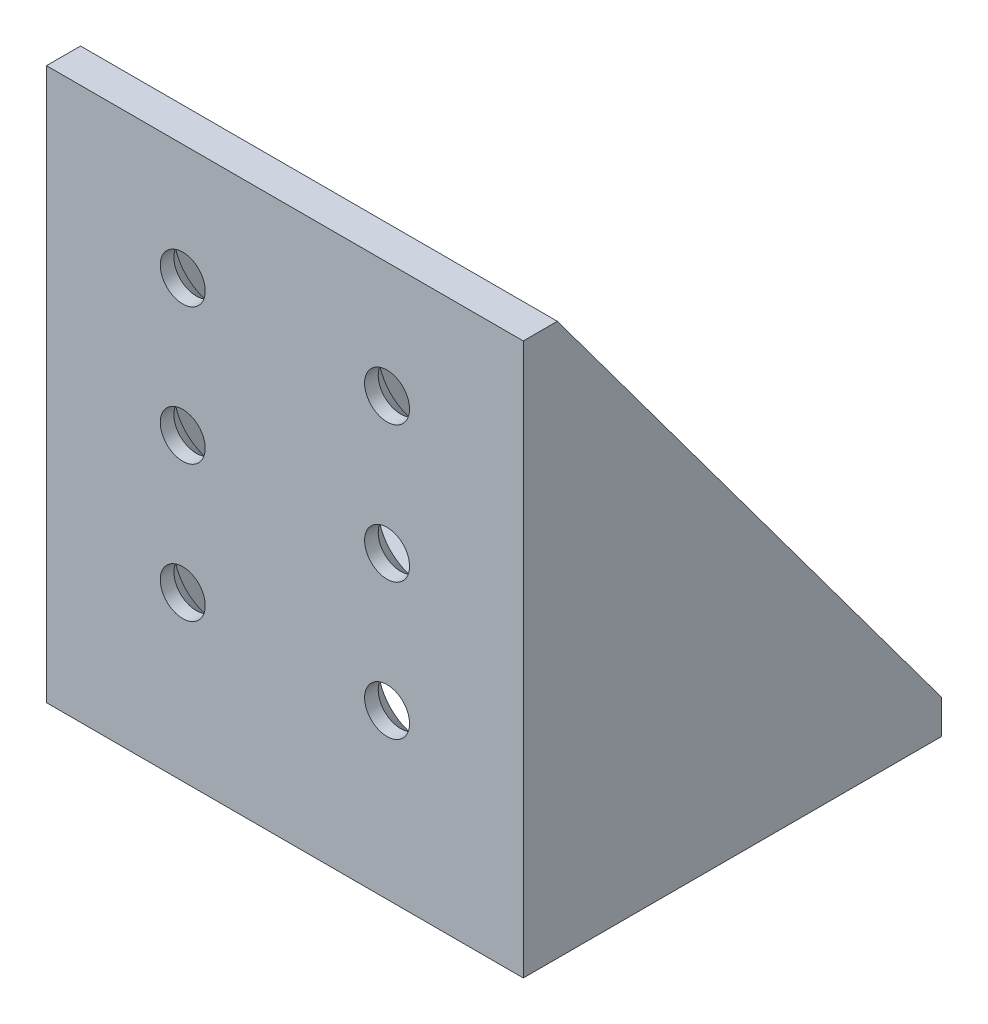
ISO-10303-21;
HEADER;
FILE_DESCRIPTION(('STEP AP214'),'2;1');
FILE_NAME('part.step','',(''),(''),'','','');
FILE_SCHEMA(('AUTOMOTIVE_DESIGN { 1 0 10303 214 1 1 1 1 }'));
ENDSEC;
DATA;
#1=APPLICATION_CONTEXT('core data for automotive mechanical design processes');
#2=APPLICATION_PROTOCOL_DEFINITION('international standard','automotive_design',2000,#1);
#3=PRODUCT_CONTEXT('',#1,'mechanical');
#4=PRODUCT('Part','Part','',(#3));
#5=PRODUCT_RELATED_PRODUCT_CATEGORY('part','',(#4));
#6=PRODUCT_DEFINITION_FORMATION('','',#4);
#7=PRODUCT_DEFINITION_CONTEXT('part definition',#1,'design');
#8=PRODUCT_DEFINITION('design','',#6,#7);
#9=PRODUCT_DEFINITION_SHAPE('','',#8);
#10=(LENGTH_UNIT() NAMED_UNIT(*) SI_UNIT(.MILLI.,.METRE.));
#11=(NAMED_UNIT(*) PLANE_ANGLE_UNIT() SI_UNIT($,.RADIAN.));
#12=(NAMED_UNIT(*) SI_UNIT($,.STERADIAN.) SOLID_ANGLE_UNIT());
#13=UNCERTAINTY_MEASURE_WITH_UNIT(LENGTH_MEASURE(1.E-05),#10,'distance_accuracy_value','');
#14=(GEOMETRIC_REPRESENTATION_CONTEXT(3) GLOBAL_UNCERTAINTY_ASSIGNED_CONTEXT((#13)) GLOBAL_UNIT_ASSIGNED_CONTEXT((#10,
#11,#12)) REPRESENTATION_CONTEXT('',''));
#15=CARTESIAN_POINT('',(0.,0.,0.));
#16=DIRECTION('',(0.,0.,1.));
#17=DIRECTION('',(1.,0.,0.));
#18=AXIS2_PLACEMENT_3D('',#15,#16,#17);
#19=CARTESIAN_POINT('',(70.,4.99999999999989,-61.4000000000002));
#20=DIRECTION('',(0.,-1.,0.));
#21=DIRECTION('',(0.,0.,-1.));
#22=AXIS2_PLACEMENT_3D('',#19,#20,#21);
#23=PLANE('',#22);
#24=CARTESIAN_POINT('',(35.,5.,-33.2000000000001));
#25=DIRECTION('',(0.,1.,0.));
#26=DIRECTION('',(0.,0.,1.));
#27=AXIS2_PLACEMENT_3D('',#24,#25,#26);
#28=CIRCLE('',#27,19.05);
#29=CARTESIAN_POINT('',(35.,5.,-14.1500000000001));
#30=VERTEX_POINT('',#29);
#31=EDGE_CURVE('E346',#30,#30,#28,.T.);
#32=ORIENTED_EDGE('',*,*,#31,.F.);
#33=EDGE_LOOP('',(#32));
#34=FACE_BOUND('',#33,.T.);
#35=CARTESIAN_POINT('',(11.455,4.99999999999989,-57.1375114030285));
#36=DIRECTION('',(0.,1.,0.));
#37=DIRECTION('',(0.,0.,1.));
#38=AXIS2_PLACEMENT_3D('',#35,#36,#37);
#39=CIRCLE('',#38,1.64999999999999);
#40=CARTESIAN_POINT('',(11.455,4.99999999999989,-55.4875114030285));
#41=VERTEX_POINT('',#40);
#42=EDGE_CURVE('E349',#41,#41,#39,.T.);
#43=ORIENTED_EDGE('',*,*,#42,.F.);
#44=EDGE_LOOP('',(#43));
#45=FACE_BOUND('',#44,.T.);
#46=CARTESIAN_POINT('',(58.5450000000001,4.99999999999989,-57.1375114030285));
#47=DIRECTION('',(0.,1.,0.));
#48=DIRECTION('',(0.,0.,1.));
#49=AXIS2_PLACEMENT_3D('',#46,#47,#48);
#50=CIRCLE('',#49,1.64999999999999);
#51=CARTESIAN_POINT('',(58.5450000000001,4.99999999999989,-55.4875114030285));
#52=VERTEX_POINT('',#51);
#53=EDGE_CURVE('E355',#52,#52,#50,.T.);
#54=ORIENTED_EDGE('',*,*,#53,.F.);
#55=EDGE_LOOP('',(#54));
#56=FACE_BOUND('',#55,.T.);
#57=CARTESIAN_POINT('',(11.455,5.,-10.0475114030284));
#58=DIRECTION('',(0.,1.,0.));
#59=DIRECTION('',(0.,0.,1.));
#60=AXIS2_PLACEMENT_3D('',#57,#58,#59);
#61=CIRCLE('',#60,1.64999999999999);
#62=CARTESIAN_POINT('',(11.455,5.,-8.39751140302841));
#63=VERTEX_POINT('',#62);
#64=EDGE_CURVE('E361',#63,#63,#61,.T.);
#65=ORIENTED_EDGE('',*,*,#64,.F.);
#66=EDGE_LOOP('',(#65));
#67=FACE_BOUND('',#66,.T.);
#68=CARTESIAN_POINT('',(58.5450000000001,5.,-10.0475114030285));
#69=DIRECTION('',(0.,1.,0.));
#70=DIRECTION('',(0.,0.,1.));
#71=AXIS2_PLACEMENT_3D('',#68,#69,#70);
#72=CIRCLE('',#71,1.64999999999999);
#73=CARTESIAN_POINT('',(58.5450000000001,5.,-8.39751140302854));
#74=VERTEX_POINT('',#73);
#75=EDGE_CURVE('E367',#74,#74,#72,.T.);
#76=ORIENTED_EDGE('',*,*,#75,.F.);
#77=EDGE_LOOP('',(#76));
#78=FACE_BOUND('',#77,.T.);
#79=DIRECTION('',(0.,0.,-1.));
#80=VECTOR('',#79,1.);
#81=CARTESIAN_POINT('',(6.80000000000003,4.99999999999989,-61.4));
#82=LINE('',#81,#80);
#83=CARTESIAN_POINT('',(6.79999999999999,5.,-5.00000000000012));
#84=VERTEX_POINT('',#83);
#85=CARTESIAN_POINT('',(6.80000000000003,4.99999999999989,-61.4));
#86=VERTEX_POINT('',#85);
#87=EDGE_CURVE('E50',#84,#86,#82,.T.);
#88=ORIENTED_EDGE('',*,*,#87,.F.);
#89=DIRECTION('',(-1.,0.,0.));
#90=VECTOR('',#89,1.);
#91=CARTESIAN_POINT('',(70.,5.,-5.00000000000012));
#92=LINE('',#91,#90);
#93=CARTESIAN_POINT('',(63.2,5.,-5.));
#94=VERTEX_POINT('',#93);
#95=EDGE_CURVE('E112',#94,#84,#92,.T.);
#96=ORIENTED_EDGE('',*,*,#95,.F.);
#97=DIRECTION('',(0.,0.,-1.));
#98=VECTOR('',#97,1.);
#99=CARTESIAN_POINT('',(63.2000000000001,4.99999999999989,-61.4000000000002));
#100=LINE('',#99,#98);
#101=CARTESIAN_POINT('',(63.2000000000001,4.99999999999989,-61.4000000000002));
#102=VERTEX_POINT('',#101);
#103=EDGE_CURVE('E102',#94,#102,#100,.T.);
#104=ORIENTED_EDGE('',*,*,#103,.T.);
#105=DIRECTION('',(-1.,0.,0.));
#106=VECTOR('',#105,1.);
#107=CARTESIAN_POINT('',(70.,4.99999999999989,-61.4000000000002));
#108=LINE('',#107,#106);
#109=EDGE_CURVE('E119',#102,#86,#108,.T.);
#110=ORIENTED_EDGE('',*,*,#109,.T.);
#111=EDGE_LOOP('',(#88,#96,#104,#110));
#112=FACE_BOUND('',#111,.T.);
#113=ADVANCED_FACE('F34',(#34,#45,#56,#67,#78,#112),#23,.F.);
#114=CARTESIAN_POINT('',(70.,5.,-5.00000000000012));
#115=DIRECTION('',(0.,0.,1.));
#116=DIRECTION('',(0.,-1.,0.));
#117=AXIS2_PLACEMENT_3D('',#114,#115,#116);
#118=PLANE('',#117);
#119=CARTESIAN_POINT('',(50.,64.,-5.00000000000012));
#120=DIRECTION('',(0.,0.,-1.));
#121=DIRECTION('',(0.,1.,0.));
#122=AXIS2_PLACEMENT_3D('',#119,#120,#121);
#123=CIRCLE('',#122,6.3);
#124=CARTESIAN_POINT('',(50.,70.3,-5.00000000000012));
#125=VERTEX_POINT('',#124);
#126=EDGE_CURVE('E295',#125,#125,#123,.T.);
#127=ORIENTED_EDGE('',*,*,#126,.F.);
#128=EDGE_LOOP('',(#127));
#129=FACE_BOUND('',#128,.T.);
#130=CARTESIAN_POINT('',(20.,64.,-5.00000000000012));
#131=DIRECTION('',(0.,0.,-1.));
#132=DIRECTION('',(0.,1.,0.));
#133=AXIS2_PLACEMENT_3D('',#130,#131,#132);
#134=CIRCLE('',#133,6.3);
#135=CARTESIAN_POINT('',(20.,70.3,-5.00000000000012));
#136=VERTEX_POINT('',#135);
#137=EDGE_CURVE('E301',#136,#136,#134,.T.);
#138=ORIENTED_EDGE('',*,*,#137,.F.);
#139=EDGE_LOOP('',(#138));
#140=FACE_BOUND('',#139,.T.);
#141=CARTESIAN_POINT('',(50.,44.,-5.00000000000012));
#142=DIRECTION('',(0.,0.,-1.));
#143=DIRECTION('',(0.,1.,0.));
#144=AXIS2_PLACEMENT_3D('',#141,#142,#143);
#145=CIRCLE('',#144,6.3);
#146=CARTESIAN_POINT('',(50.,50.3,-5.00000000000012));
#147=VERTEX_POINT('',#146);
#148=EDGE_CURVE('E310',#147,#147,#145,.T.);
#149=ORIENTED_EDGE('',*,*,#148,.F.);
#150=EDGE_LOOP('',(#149));
#151=FACE_BOUND('',#150,.T.);
#152=CARTESIAN_POINT('',(20.,44.,-5.00000000000012));
#153=DIRECTION('',(0.,0.,-1.));
#154=DIRECTION('',(0.,1.,0.));
#155=AXIS2_PLACEMENT_3D('',#152,#153,#154);
#156=CIRCLE('',#155,6.3);
#157=CARTESIAN_POINT('',(20.,50.3,-5.00000000000012));
#158=VERTEX_POINT('',#157);
#159=EDGE_CURVE('E319',#158,#158,#156,.T.);
#160=ORIENTED_EDGE('',*,*,#159,.F.);
#161=EDGE_LOOP('',(#160));
#162=FACE_BOUND('',#161,.T.);
#163=CARTESIAN_POINT('',(50.,24.,-5.00000000000012));
#164=DIRECTION('',(0.,0.,-1.));
#165=DIRECTION('',(0.,1.,0.));
#166=AXIS2_PLACEMENT_3D('',#163,#164,#165);
#167=CIRCLE('',#166,6.3);
#168=CARTESIAN_POINT('',(50.,30.3,-5.00000000000012));
#169=VERTEX_POINT('',#168);
#170=EDGE_CURVE('E328',#169,#169,#167,.T.);
#171=ORIENTED_EDGE('',*,*,#170,.F.);
#172=EDGE_LOOP('',(#171));
#173=FACE_BOUND('',#172,.T.);
#174=CARTESIAN_POINT('',(20.,24.,-5.00000000000012));
#175=DIRECTION('',(0.,0.,-1.));
#176=DIRECTION('',(0.,1.,0.));
#177=AXIS2_PLACEMENT_3D('',#174,#175,#176);
#178=CIRCLE('',#177,6.3);
#179=CARTESIAN_POINT('',(20.,30.3,-5.00000000000012));
#180=VERTEX_POINT('',#179);
#181=EDGE_CURVE('E337',#180,#180,#178,.T.);
#182=ORIENTED_EDGE('',*,*,#181,.F.);
#183=EDGE_LOOP('',(#182));
#184=FACE_BOUND('',#183,.T.);
#185=DIRECTION('',(0.,-1.,0.));
#186=VECTOR('',#185,1.);
#187=CARTESIAN_POINT('',(6.79999999999999,5.,-5.00000000000012));
#188=LINE('',#187,#186);
#189=CARTESIAN_POINT('',(6.79999999999999,81.,-5.00000000000012));
#190=VERTEX_POINT('',#189);
#191=EDGE_CURVE('E373',#190,#84,#188,.T.);
#192=ORIENTED_EDGE('',*,*,#191,.F.);
#193=DIRECTION('',(-1.,0.,0.));
#194=VECTOR('',#193,1.);
#195=CARTESIAN_POINT('',(70.,81.,-5.00000000000012));
#196=LINE('',#195,#194);
#197=CARTESIAN_POINT('',(63.2,81.,-5.00000000000003));
#198=VERTEX_POINT('',#197);
#199=EDGE_CURVE('E115',#198,#190,#196,.T.);
#200=ORIENTED_EDGE('',*,*,#199,.F.);
#201=DIRECTION('',(0.,-1.,0.));
#202=VECTOR('',#201,1.);
#203=CARTESIAN_POINT('',(63.2,5.,-5.));
#204=LINE('',#203,#202);
#205=EDGE_CURVE('E105',#198,#94,#204,.T.);
#206=ORIENTED_EDGE('',*,*,#205,.T.);
#207=ORIENTED_EDGE('',*,*,#95,.T.);
#208=EDGE_LOOP('',(#192,#200,#206,#207));
#209=FACE_BOUND('',#208,.T.);
#210=ADVANCED_FACE('F111',(#129,#140,#151,#162,#173,#184,#209),#118,.F.);
#211=CARTESIAN_POINT('',(70.,81.,0.));
#212=DIRECTION('',(0.,0.,-1.));
#213=DIRECTION('',(0.,1.,0.));
#214=AXIS2_PLACEMENT_3D('',#211,#212,#213);
#215=PLANE('',#214);
#216=CARTESIAN_POINT('',(50.,64.,-1.11022302462516E-13));
#217=DIRECTION('',(0.,0.,-1.));
#218=DIRECTION('',(0.,1.,0.));
#219=AXIS2_PLACEMENT_3D('',#216,#217,#218);
#220=CIRCLE('',#219,3.3);
#221=CARTESIAN_POINT('',(50.,67.3,-1.11097625981867E-13));
#222=VERTEX_POINT('',#221);
#223=EDGE_CURVE('E297',#222,#222,#220,.T.);
#224=ORIENTED_EDGE('',*,*,#223,.T.);
#225=EDGE_LOOP('',(#224));
#226=FACE_BOUND('',#225,.T.);
#227=CARTESIAN_POINT('',(20.,64.,0.));
#228=DIRECTION('',(0.,0.,-1.));
#229=DIRECTION('',(0.,1.,0.));
#230=AXIS2_PLACEMENT_3D('',#227,#228,#229);
#231=CIRCLE('',#230,3.3);
#232=CARTESIAN_POINT('',(20.,67.3,0.));
#233=VERTEX_POINT('',#232);
#234=EDGE_CURVE('E307',#233,#233,#231,.T.);
#235=ORIENTED_EDGE('',*,*,#234,.T.);
#236=EDGE_LOOP('',(#235));
#237=FACE_BOUND('',#236,.T.);
#238=CARTESIAN_POINT('',(50.,44.,0.));
#239=DIRECTION('',(0.,0.,-1.));
#240=DIRECTION('',(0.,1.,0.));
#241=AXIS2_PLACEMENT_3D('',#238,#239,#240);
#242=CIRCLE('',#241,3.3);
#243=CARTESIAN_POINT('',(50.,47.3,0.));
#244=VERTEX_POINT('',#243);
#245=EDGE_CURVE('E316',#244,#244,#242,.T.);
#246=ORIENTED_EDGE('',*,*,#245,.T.);
#247=EDGE_LOOP('',(#246));
#248=FACE_BOUND('',#247,.T.);
#249=CARTESIAN_POINT('',(20.,44.,0.));
#250=DIRECTION('',(0.,0.,-1.));
#251=DIRECTION('',(0.,1.,0.));
#252=AXIS2_PLACEMENT_3D('',#249,#250,#251);
#253=CIRCLE('',#252,3.3);
#254=CARTESIAN_POINT('',(20.,47.3,0.));
#255=VERTEX_POINT('',#254);
#256=EDGE_CURVE('E325',#255,#255,#253,.T.);
#257=ORIENTED_EDGE('',*,*,#256,.T.);
#258=EDGE_LOOP('',(#257));
#259=FACE_BOUND('',#258,.T.);
#260=CARTESIAN_POINT('',(50.,24.,0.));
#261=DIRECTION('',(0.,0.,-1.));
#262=DIRECTION('',(0.,1.,0.));
#263=AXIS2_PLACEMENT_3D('',#260,#261,#262);
#264=CIRCLE('',#263,3.3);
#265=CARTESIAN_POINT('',(50.,27.3,0.));
#266=VERTEX_POINT('',#265);
#267=EDGE_CURVE('E334',#266,#266,#264,.T.);
#268=ORIENTED_EDGE('',*,*,#267,.T.);
#269=EDGE_LOOP('',(#268));
#270=FACE_BOUND('',#269,.T.);
#271=CARTESIAN_POINT('',(20.,24.,0.));
#272=DIRECTION('',(0.,0.,-1.));
#273=DIRECTION('',(0.,1.,0.));
#274=AXIS2_PLACEMENT_3D('',#271,#272,#273);
#275=CIRCLE('',#274,3.3);
#276=CARTESIAN_POINT('',(20.,27.3,0.));
#277=VERTEX_POINT('',#276);
#278=EDGE_CURVE('E343',#277,#277,#275,.T.);
#279=ORIENTED_EDGE('',*,*,#278,.T.);
#280=EDGE_LOOP('',(#279));
#281=FACE_BOUND('',#280,.T.);
#282=DIRECTION('',(0.,-1.,0.));
#283=VECTOR('',#282,1.);
#284=CARTESIAN_POINT('',(0.,81.,-1.11022302462516E-13));
#285=LINE('',#284,#283);
#286=CARTESIAN_POINT('',(0.,81.,-1.11022302462516E-13));
#287=VERTEX_POINT('',#286);
#288=CARTESIAN_POINT('',(0.,0.,0.));
#289=VERTEX_POINT('',#288);
#290=EDGE_CURVE('E149',#287,#289,#285,.T.);
#291=ORIENTED_EDGE('',*,*,#290,.T.);
#292=DIRECTION('',(-1.,0.,0.));
#293=VECTOR('',#292,1.);
#294=CARTESIAN_POINT('',(70.,0.,-1.11022302462516E-13));
#295=LINE('',#294,#293);
#296=CARTESIAN_POINT('',(70.,0.,-1.11022302462516E-13));
#297=VERTEX_POINT('',#296);
#298=EDGE_CURVE('E11',#297,#289,#295,.T.);
#299=ORIENTED_EDGE('',*,*,#298,.F.);
#300=DIRECTION('',(0.,-1.,0.));
#301=VECTOR('',#300,1.);
#302=CARTESIAN_POINT('',(70.,81.,0.));
#303=LINE('',#302,#301);
#304=CARTESIAN_POINT('',(70.,81.,0.));
#305=VERTEX_POINT('',#304);
#306=EDGE_CURVE('E147',#305,#297,#303,.T.);
#307=ORIENTED_EDGE('',*,*,#306,.F.);
#308=DIRECTION('',(-1.,0.,0.));
#309=VECTOR('',#308,1.);
#310=CARTESIAN_POINT('',(70.,81.,0.));
#311=LINE('',#310,#309);
#312=EDGE_CURVE('E152',#305,#287,#311,.T.);
#313=ORIENTED_EDGE('',*,*,#312,.T.);
#314=EDGE_LOOP('',(#291,#299,#307,#313));
#315=FACE_BOUND('',#314,.T.);
#316=ADVANCED_FACE('F36',(#226,#237,#248,#259,#270,#281,#315),#215,.F.);
#317=CARTESIAN_POINT('',(70.,0.,-1.11022302462516E-13));
#318=DIRECTION('',(0.,1.,0.));
#319=DIRECTION('',(0.,0.,1.));
#320=AXIS2_PLACEMENT_3D('',#317,#318,#319);
#321=PLANE('',#320);
#322=CARTESIAN_POINT('',(35.,0.,-33.2000000000001));
#323=DIRECTION('',(0.,1.,0.));
#324=DIRECTION('',(0.,0.,1.));
#325=AXIS2_PLACEMENT_3D('',#322,#323,#324);
#326=CIRCLE('',#325,19.05);
#327=CARTESIAN_POINT('',(35.,0.,-14.1500000000001));
#328=VERTEX_POINT('',#327);
#329=EDGE_CURVE('E38',#328,#328,#326,.T.);
#330=ORIENTED_EDGE('',*,*,#329,.T.);
#331=EDGE_LOOP('',(#330));
#332=FACE_BOUND('',#331,.T.);
#333=CARTESIAN_POINT('',(11.455,-1.11022302462516E-13,-57.1375114030285));
#334=DIRECTION('',(0.,1.,0.));
#335=DIRECTION('',(0.,0.,1.));
#336=AXIS2_PLACEMENT_3D('',#333,#334,#335);
#337=CIRCLE('',#336,1.65);
#338=CARTESIAN_POINT('',(11.455,-1.11225302018215E-13,-55.4875114030285));
#339=VERTEX_POINT('',#338);
#340=EDGE_CURVE('E352',#339,#339,#337,.T.);
#341=ORIENTED_EDGE('',*,*,#340,.T.);
#342=EDGE_LOOP('',(#341));
#343=FACE_BOUND('',#342,.T.);
#344=CARTESIAN_POINT('',(58.5450000000001,-1.11022302462516E-13,-57.1375114030285));
#345=DIRECTION('',(0.,1.,0.));
#346=DIRECTION('',(0.,0.,1.));
#347=AXIS2_PLACEMENT_3D('',#344,#345,#346);
#348=CIRCLE('',#347,1.65);
#349=CARTESIAN_POINT('',(58.5450000000001,-1.11225302018215E-13,-55.4875114030285));
#350=VERTEX_POINT('',#349);
#351=EDGE_CURVE('E358',#350,#350,#348,.T.);
#352=ORIENTED_EDGE('',*,*,#351,.T.);
#353=EDGE_LOOP('',(#352));
#354=FACE_BOUND('',#353,.T.);
#355=CARTESIAN_POINT('',(11.455,0.,-10.0475114030284));
#356=DIRECTION('',(0.,1.,0.));
#357=DIRECTION('',(0.,0.,1.));
#358=AXIS2_PLACEMENT_3D('',#355,#356,#357);
#359=CIRCLE('',#358,1.65);
#360=CARTESIAN_POINT('',(11.455,0.,-8.3975114030284));
#361=VERTEX_POINT('',#360);
#362=EDGE_CURVE('E364',#361,#361,#359,.T.);
#363=ORIENTED_EDGE('',*,*,#362,.T.);
#364=EDGE_LOOP('',(#363));
#365=FACE_BOUND('',#364,.T.);
#366=CARTESIAN_POINT('',(58.5450000000001,0.,-10.0475114030285));
#367=DIRECTION('',(0.,1.,0.));
#368=DIRECTION('',(0.,0.,1.));
#369=AXIS2_PLACEMENT_3D('',#366,#367,#368);
#370=CIRCLE('',#369,1.65);
#371=CARTESIAN_POINT('',(58.5450000000001,0.,-8.39751140302854));
#372=VERTEX_POINT('',#371);
#373=EDGE_CURVE('E370',#372,#372,#370,.T.);
#374=ORIENTED_EDGE('',*,*,#373,.T.);
#375=EDGE_LOOP('',(#374));
#376=FACE_BOUND('',#375,.T.);
#377=DIRECTION('',(0.,0.,-1.));
#378=VECTOR('',#377,1.);
#379=CARTESIAN_POINT('',(0.,0.,0.));
#380=LINE('',#379,#378);
#381=CARTESIAN_POINT('',(0.,-1.11022302462516E-13,-61.4000000000001));
#382=VERTEX_POINT('',#381);
#383=EDGE_CURVE('E142',#289,#382,#380,.T.);
#384=ORIENTED_EDGE('',*,*,#383,.T.);
#385=DIRECTION('',(-1.,0.,0.));
#386=VECTOR('',#385,1.);
#387=CARTESIAN_POINT('',(70.,-1.11022302462516E-13,-61.4000000000002));
#388=LINE('',#387,#386);
#389=CARTESIAN_POINT('',(70.,-1.11022302462516E-13,-61.4000000000002));
#390=VERTEX_POINT('',#389);
#391=EDGE_CURVE('E43',#390,#382,#388,.T.);
#392=ORIENTED_EDGE('',*,*,#391,.F.);
#393=DIRECTION('',(0.,0.,-1.));
#394=VECTOR('',#393,1.);
#395=CARTESIAN_POINT('',(70.,0.,-1.11022302462516E-13));
#396=LINE('',#395,#394);
#397=EDGE_CURVE('E164',#297,#390,#396,.T.);
#398=ORIENTED_EDGE('',*,*,#397,.F.);
#399=ORIENTED_EDGE('',*,*,#298,.T.);
#400=EDGE_LOOP('',(#384,#392,#398,#399));
#401=FACE_BOUND('',#400,.T.);
#402=ADVANCED_FACE('F173',(#332,#343,#354,#365,#376,#401),#321,.F.);
#403=CARTESIAN_POINT('',(70.,-1.11022302462516E-13,-61.4000000000002));
#404=DIRECTION('',(0.,0.,1.));
#405=DIRECTION('',(1.,0.,0.));
#406=AXIS2_PLACEMENT_3D('',#403,#404,#405);
#407=PLANE('',#406);
#408=DIRECTION('',(0.,1.,0.));
#409=VECTOR('',#408,1.);
#410=CARTESIAN_POINT('',(0.,-1.11022302462516E-13,-61.4000000000001));
#411=LINE('',#410,#409);
#412=CARTESIAN_POINT('',(0.,4.99999999999989,-61.4000000000001));
#413=VERTEX_POINT('',#412);
#414=EDGE_CURVE('E132',#382,#413,#411,.T.);
#415=ORIENTED_EDGE('',*,*,#414,.T.);
#416=DIRECTION('',(-1.,0.,0.));
#417=VECTOR('',#416,1.);
#418=CARTESIAN_POINT('',(6.80000000000003,4.99999999999989,-61.4));
#419=LINE('',#418,#417);
#420=EDGE_CURVE('E58',#86,#413,#419,.T.);
#421=ORIENTED_EDGE('',*,*,#420,.F.);
#422=ORIENTED_EDGE('',*,*,#109,.F.);
#423=CARTESIAN_POINT('',(70.,4.99999999999989,-61.4000000000002));
#424=VERTEX_POINT('',#423);
#425=EDGE_CURVE('E122',#424,#102,#108,.T.);
#426=ORIENTED_EDGE('',*,*,#425,.F.);
#427=DIRECTION('',(0.,1.,0.));
#428=VECTOR('',#427,1.);
#429=CARTESIAN_POINT('',(70.,-1.11022302462516E-13,-61.4000000000002));
#430=LINE('',#429,#428);
#431=EDGE_CURVE('E135',#390,#424,#430,.T.);
#432=ORIENTED_EDGE('',*,*,#431,.F.);
#433=ORIENTED_EDGE('',*,*,#391,.T.);
#434=EDGE_LOOP('',(#415,#421,#422,#426,#432,#433));
#435=FACE_BOUND('',#434,.T.);
#436=ADVANCED_FACE('F131',(#435),#407,.F.);
#437=CARTESIAN_POINT('',(70.,81.,-5.00000000000012));
#438=DIRECTION('',(0.,-1.,0.));
#439=DIRECTION('',(0.,0.,-1.));
#440=AXIS2_PLACEMENT_3D('',#437,#438,#439);
#441=PLANE('',#440);
#442=DIRECTION('',(0.,0.,1.));
#443=VECTOR('',#442,1.);
#444=CARTESIAN_POINT('',(0.,81.,-5.00000000000012));
#445=LINE('',#444,#443);
#446=CARTESIAN_POINT('',(0.,81.,-5.00000000000012));
#447=VERTEX_POINT('',#446);
#448=EDGE_CURVE('E145',#447,#287,#445,.T.);
#449=ORIENTED_EDGE('',*,*,#448,.T.);
#450=ORIENTED_EDGE('',*,*,#312,.F.);
#451=DIRECTION('',(0.,0.,1.));
#452=VECTOR('',#451,1.);
#453=CARTESIAN_POINT('',(70.,81.,-5.00000000000012));
#454=LINE('',#453,#452);
#455=CARTESIAN_POINT('',(70.,81.,-5.00000000000012));
#456=VERTEX_POINT('',#455);
#457=EDGE_CURVE('E154',#456,#305,#454,.T.);
#458=ORIENTED_EDGE('',*,*,#457,.F.);
#459=EDGE_CURVE('E120',#456,#198,#196,.T.);
#460=ORIENTED_EDGE('',*,*,#459,.T.);
#461=ORIENTED_EDGE('',*,*,#199,.T.);
#462=DIRECTION('',(-1.,0.,0.));
#463=VECTOR('',#462,1.);
#464=CARTESIAN_POINT('',(6.79999999999999,81.,-5.00000000000012));
#465=LINE('',#464,#463);
#466=EDGE_CURVE('E379',#190,#447,#465,.T.);
#467=ORIENTED_EDGE('',*,*,#466,.T.);
#468=EDGE_LOOP('',(#449,#450,#458,#460,#461,#467));
#469=FACE_BOUND('',#468,.T.);
#470=ADVANCED_FACE('F195',(#469),#441,.F.);
#471=CARTESIAN_POINT('',(70.,0.,-1.11022302462516E-13));
#472=DIRECTION('',(1.,0.,0.));
#473=DIRECTION('',(0.,0.,-1.));
#474=AXIS2_PLACEMENT_3D('',#471,#472,#473);
#475=PLANE('',#474);
#476=DIRECTION('',(0.,0.803032782324744,0.595934854251521));
#477=VECTOR('',#476,1.);
#478=CARTESIAN_POINT('',(70.,81.,-5.00000000000012));
#479=LINE('',#478,#477);
#480=EDGE_CURVE('E117',#424,#456,#479,.T.);
#481=ORIENTED_EDGE('',*,*,#480,.T.);
#482=ORIENTED_EDGE('',*,*,#457,.T.);
#483=ORIENTED_EDGE('',*,*,#306,.T.);
#484=ORIENTED_EDGE('',*,*,#397,.T.);
#485=ORIENTED_EDGE('',*,*,#431,.T.);
#486=EDGE_LOOP('',(#481,#482,#483,#484,#485));
#487=FACE_BOUND('',#486,.T.);
#488=ADVANCED_FACE('F172',(#487),#475,.T.);
#489=CARTESIAN_POINT('',(0.,0.,0.));
#490=DIRECTION('',(1.,0.,0.));
#491=DIRECTION('',(0.,0.,-1.));
#492=AXIS2_PLACEMENT_3D('',#489,#490,#491);
#493=PLANE('',#492);
#494=ORIENTED_EDGE('',*,*,#448,.F.);
#495=DIRECTION('',(0.,0.803032782324744,0.595934854251521));
#496=VECTOR('',#495,1.);
#497=CARTESIAN_POINT('',(0.,81.,-5.00000000000012));
#498=LINE('',#497,#496);
#499=EDGE_CURVE('E144',#413,#447,#498,.T.);
#500=ORIENTED_EDGE('',*,*,#499,.F.);
#501=ORIENTED_EDGE('',*,*,#414,.F.);
#502=ORIENTED_EDGE('',*,*,#383,.F.);
#503=ORIENTED_EDGE('',*,*,#290,.F.);
#504=EDGE_LOOP('',(#494,#500,#501,#502,#503));
#505=FACE_BOUND('',#504,.T.);
#506=ADVANCED_FACE('F140',(#505),#493,.F.);
#507=CARTESIAN_POINT('',(63.2,81.,-5.00000000000003));
#508=DIRECTION('',(0.,0.59593485425152,-0.803032782324745));
#509=DIRECTION('',(0.,0.803032782324744,0.595934854251521));
#510=AXIS2_PLACEMENT_3D('',#507,#508,#509);
#511=PLANE('',#510);
#512=ORIENTED_EDGE('',*,*,#480,.F.);
#513=ORIENTED_EDGE('',*,*,#425,.T.);
#514=DIRECTION('',(0.,0.803032782324744,0.595934854251521));
#515=VECTOR('',#514,1.);
#516=CARTESIAN_POINT('',(63.2,81.,-5.00000000000003));
#517=LINE('',#516,#515);
#518=EDGE_CURVE('E107',#102,#198,#517,.T.);
#519=ORIENTED_EDGE('',*,*,#518,.T.);
#520=ORIENTED_EDGE('',*,*,#459,.F.);
#521=EDGE_LOOP('',(#512,#513,#519,#520));
#522=FACE_BOUND('',#521,.T.);
#523=ADVANCED_FACE('F206',(#522),#511,.T.);
#524=CARTESIAN_POINT('',(63.2,0.,-1.11022302462516E-13));
#525=DIRECTION('',(1.,0.,0.));
#526=DIRECTION('',(0.,0.,-1.));
#527=AXIS2_PLACEMENT_3D('',#524,#525,#526);
#528=PLANE('',#527);
#529=ORIENTED_EDGE('',*,*,#205,.F.);
#530=ORIENTED_EDGE('',*,*,#518,.F.);
#531=ORIENTED_EDGE('',*,*,#103,.F.);
#532=EDGE_LOOP('',(#529,#530,#531));
#533=FACE_BOUND('',#532,.T.);
#534=ADVANCED_FACE('F104',(#533),#528,.F.);
#535=CARTESIAN_POINT('',(6.79999999999999,81.,-5.00000000000012));
#536=DIRECTION('',(0.,-0.59593485425152,0.803032782324745));
#537=DIRECTION('',(0.,-0.803032782324744,-0.595934854251521));
#538=AXIS2_PLACEMENT_3D('',#535,#536,#537);
#539=PLANE('',#538);
#540=ORIENTED_EDGE('',*,*,#499,.T.);
#541=ORIENTED_EDGE('',*,*,#466,.F.);
#542=DIRECTION('',(0.,0.803032782324744,0.595934854251521));
#543=VECTOR('',#542,1.);
#544=CARTESIAN_POINT('',(6.79999999999999,81.,-5.00000000000012));
#545=LINE('',#544,#543);
#546=EDGE_CURVE('E375',#86,#190,#545,.T.);
#547=ORIENTED_EDGE('',*,*,#546,.F.);
#548=ORIENTED_EDGE('',*,*,#420,.T.);
#549=EDGE_LOOP('',(#540,#541,#547,#548));
#550=FACE_BOUND('',#549,.T.);
#551=ADVANCED_FACE('F212',(#550),#539,.F.);
#552=CARTESIAN_POINT('',(6.79999999999999,0.,-1.11022302462516E-13));
#553=DIRECTION('',(-1.,0.,0.));
#554=DIRECTION('',(0.,0.,-1.));
#555=AXIS2_PLACEMENT_3D('',#552,#553,#554);
#556=PLANE('',#555);
#557=ORIENTED_EDGE('',*,*,#191,.T.);
#558=ORIENTED_EDGE('',*,*,#87,.T.);
#559=ORIENTED_EDGE('',*,*,#546,.T.);
#560=EDGE_LOOP('',(#557,#558,#559));
#561=FACE_BOUND('',#560,.T.);
#562=ADVANCED_FACE('F215',(#561),#556,.F.);
#563=CARTESIAN_POINT('',(58.5450000000001,5.,-10.0475114030285));
#564=DIRECTION('',(0.,1.,0.));
#565=DIRECTION('',(0.,0.,1.));
#566=AXIS2_PLACEMENT_3D('',#563,#564,#565);
#567=CYLINDRICAL_SURFACE('',#566,1.65);
#568=ORIENTED_EDGE('',*,*,#373,.F.);
#569=EDGE_LOOP('',(#568));
#570=FACE_BOUND('',#569,.T.);
#571=ORIENTED_EDGE('',*,*,#75,.T.);
#572=EDGE_LOOP('',(#571));
#573=FACE_BOUND('',#572,.T.);
#574=ADVANCED_FACE('F219',(#570,#573),#567,.F.);
#575=CARTESIAN_POINT('',(11.455,5.,-10.0475114030284));
#576=DIRECTION('',(0.,1.,0.));
#577=DIRECTION('',(0.,0.,1.));
#578=AXIS2_PLACEMENT_3D('',#575,#576,#577);
#579=CYLINDRICAL_SURFACE('',#578,1.64999999999999);
#580=ORIENTED_EDGE('',*,*,#362,.F.);
#581=EDGE_LOOP('',(#580));
#582=FACE_BOUND('',#581,.T.);
#583=ORIENTED_EDGE('',*,*,#64,.T.);
#584=EDGE_LOOP('',(#583));
#585=FACE_BOUND('',#584,.T.);
#586=ADVANCED_FACE('F223',(#582,#585),#579,.F.);
#587=CARTESIAN_POINT('',(58.5450000000001,4.99999999999989,-57.1375114030285));
#588=DIRECTION('',(0.,1.,0.));
#589=DIRECTION('',(0.,0.,1.));
#590=AXIS2_PLACEMENT_3D('',#587,#588,#589);
#591=CYLINDRICAL_SURFACE('',#590,1.65);
#592=ORIENTED_EDGE('',*,*,#351,.F.);
#593=EDGE_LOOP('',(#592));
#594=FACE_BOUND('',#593,.T.);
#595=ORIENTED_EDGE('',*,*,#53,.T.);
#596=EDGE_LOOP('',(#595));
#597=FACE_BOUND('',#596,.T.);
#598=ADVANCED_FACE('F227',(#594,#597),#591,.F.);
#599=CARTESIAN_POINT('',(11.455,4.99999999999989,-57.1375114030285));
#600=DIRECTION('',(0.,1.,0.));
#601=DIRECTION('',(0.,0.,1.));
#602=AXIS2_PLACEMENT_3D('',#599,#600,#601);
#603=CYLINDRICAL_SURFACE('',#602,1.64999999999999);
#604=ORIENTED_EDGE('',*,*,#340,.F.);
#605=EDGE_LOOP('',(#604));
#606=FACE_BOUND('',#605,.T.);
#607=ORIENTED_EDGE('',*,*,#42,.T.);
#608=EDGE_LOOP('',(#607));
#609=FACE_BOUND('',#608,.T.);
#610=ADVANCED_FACE('F231',(#606,#609),#603,.F.);
#611=CARTESIAN_POINT('',(35.,-4.8,-33.2000000000001));
#612=DIRECTION('',(0.,1.,0.));
#613=DIRECTION('',(0.,0.,1.));
#614=AXIS2_PLACEMENT_3D('',#611,#612,#613);
#615=CYLINDRICAL_SURFACE('',#614,19.05);
#616=ORIENTED_EDGE('',*,*,#31,.T.);
#617=EDGE_LOOP('',(#616));
#618=FACE_BOUND('',#617,.T.);
#619=ORIENTED_EDGE('',*,*,#329,.F.);
#620=EDGE_LOOP('',(#619));
#621=FACE_BOUND('',#620,.T.);
#622=ADVANCED_FACE('F235',(#618,#621),#615,.F.);
#623=CARTESIAN_POINT('',(20.,24.,-5.00000000000012));
#624=DIRECTION('',(0.,0.,-1.));
#625=DIRECTION('',(0.,1.,0.));
#626=AXIS2_PLACEMENT_3D('',#623,#624,#625);
#627=CYLINDRICAL_SURFACE('',#626,3.3);
#628=ORIENTED_EDGE('',*,*,#278,.F.);
#629=EDGE_LOOP('',(#628));
#630=FACE_BOUND('',#629,.T.);
#631=CARTESIAN_POINT('',(20.,24.,-2.00000000000011));
#632=DIRECTION('',(0.,0.,-1.));
#633=DIRECTION('',(0.,1.,0.));
#634=AXIS2_PLACEMENT_3D('',#631,#632,#633);
#635=CIRCLE('',#634,3.3);
#636=CARTESIAN_POINT('',(20.,27.3,-2.00000000000011));
#637=VERTEX_POINT('',#636);
#638=EDGE_CURVE('E340',#637,#637,#635,.T.);
#639=ORIENTED_EDGE('',*,*,#638,.T.);
#640=EDGE_LOOP('',(#639));
#641=FACE_BOUND('',#640,.T.);
#642=ADVANCED_FACE('F239',(#630,#641),#627,.F.);
#643=CARTESIAN_POINT('',(20.,24.,-5.00000000000012));
#644=DIRECTION('',(0.,0.,-1.));
#645=DIRECTION('',(0.,1.,0.));
#646=AXIS2_PLACEMENT_3D('',#643,#644,#645);
#647=CONICAL_SURFACE('',#646,6.3,0.785398163397448);
#648=ORIENTED_EDGE('',*,*,#638,.F.);
#649=EDGE_LOOP('',(#648));
#650=FACE_BOUND('',#649,.T.);
#651=ORIENTED_EDGE('',*,*,#181,.T.);
#652=EDGE_LOOP('',(#651));
#653=FACE_BOUND('',#652,.T.);
#654=ADVANCED_FACE('F243',(#650,#653),#647,.F.);
#655=CARTESIAN_POINT('',(50.,24.,-5.00000000000012));
#656=DIRECTION('',(0.,0.,-1.));
#657=DIRECTION('',(0.,1.,0.));
#658=AXIS2_PLACEMENT_3D('',#655,#656,#657);
#659=CYLINDRICAL_SURFACE('',#658,3.3);
#660=ORIENTED_EDGE('',*,*,#267,.F.);
#661=EDGE_LOOP('',(#660));
#662=FACE_BOUND('',#661,.T.);
#663=CARTESIAN_POINT('',(50.,24.,-2.00000000000011));
#664=DIRECTION('',(0.,0.,-1.));
#665=DIRECTION('',(0.,1.,0.));
#666=AXIS2_PLACEMENT_3D('',#663,#664,#665);
#667=CIRCLE('',#666,3.3);
#668=CARTESIAN_POINT('',(50.,27.3,-2.00000000000011));
#669=VERTEX_POINT('',#668);
#670=EDGE_CURVE('E331',#669,#669,#667,.T.);
#671=ORIENTED_EDGE('',*,*,#670,.T.);
#672=EDGE_LOOP('',(#671));
#673=FACE_BOUND('',#672,.T.);
#674=ADVANCED_FACE('F247',(#662,#673),#659,.F.);
#675=CARTESIAN_POINT('',(50.,24.,-5.00000000000012));
#676=DIRECTION('',(0.,0.,-1.));
#677=DIRECTION('',(0.,1.,0.));
#678=AXIS2_PLACEMENT_3D('',#675,#676,#677);
#679=CONICAL_SURFACE('',#678,6.3,0.785398163397448);
#680=ORIENTED_EDGE('',*,*,#670,.F.);
#681=EDGE_LOOP('',(#680));
#682=FACE_BOUND('',#681,.T.);
#683=ORIENTED_EDGE('',*,*,#170,.T.);
#684=EDGE_LOOP('',(#683));
#685=FACE_BOUND('',#684,.T.);
#686=ADVANCED_FACE('F251',(#682,#685),#679,.F.);
#687=CARTESIAN_POINT('',(20.,44.,-5.00000000000012));
#688=DIRECTION('',(0.,0.,-1.));
#689=DIRECTION('',(0.,1.,0.));
#690=AXIS2_PLACEMENT_3D('',#687,#688,#689);
#691=CYLINDRICAL_SURFACE('',#690,3.3);
#692=ORIENTED_EDGE('',*,*,#256,.F.);
#693=EDGE_LOOP('',(#692));
#694=FACE_BOUND('',#693,.T.);
#695=CARTESIAN_POINT('',(20.,44.,-2.00000000000011));
#696=DIRECTION('',(0.,0.,-1.));
#697=DIRECTION('',(0.,1.,0.));
#698=AXIS2_PLACEMENT_3D('',#695,#696,#697);
#699=CIRCLE('',#698,3.3);
#700=CARTESIAN_POINT('',(20.,47.3,-2.00000000000011));
#701=VERTEX_POINT('',#700);
#702=EDGE_CURVE('E322',#701,#701,#699,.T.);
#703=ORIENTED_EDGE('',*,*,#702,.T.);
#704=EDGE_LOOP('',(#703));
#705=FACE_BOUND('',#704,.T.);
#706=ADVANCED_FACE('F255',(#694,#705),#691,.F.);
#707=CARTESIAN_POINT('',(20.,44.,-5.00000000000012));
#708=DIRECTION('',(0.,0.,-1.));
#709=DIRECTION('',(0.,1.,0.));
#710=AXIS2_PLACEMENT_3D('',#707,#708,#709);
#711=CONICAL_SURFACE('',#710,6.3,0.785398163397448);
#712=ORIENTED_EDGE('',*,*,#702,.F.);
#713=EDGE_LOOP('',(#712));
#714=FACE_BOUND('',#713,.T.);
#715=ORIENTED_EDGE('',*,*,#159,.T.);
#716=EDGE_LOOP('',(#715));
#717=FACE_BOUND('',#716,.T.);
#718=ADVANCED_FACE('F259',(#714,#717),#711,.F.);
#719=CARTESIAN_POINT('',(50.,44.,-5.00000000000012));
#720=DIRECTION('',(0.,0.,-1.));
#721=DIRECTION('',(0.,1.,0.));
#722=AXIS2_PLACEMENT_3D('',#719,#720,#721);
#723=CYLINDRICAL_SURFACE('',#722,3.3);
#724=ORIENTED_EDGE('',*,*,#245,.F.);
#725=EDGE_LOOP('',(#724));
#726=FACE_BOUND('',#725,.T.);
#727=CARTESIAN_POINT('',(50.,44.,-2.00000000000011));
#728=DIRECTION('',(0.,0.,-1.));
#729=DIRECTION('',(0.,1.,0.));
#730=AXIS2_PLACEMENT_3D('',#727,#728,#729);
#731=CIRCLE('',#730,3.3);
#732=CARTESIAN_POINT('',(50.,47.3,-2.00000000000011));
#733=VERTEX_POINT('',#732);
#734=EDGE_CURVE('E313',#733,#733,#731,.T.);
#735=ORIENTED_EDGE('',*,*,#734,.T.);
#736=EDGE_LOOP('',(#735));
#737=FACE_BOUND('',#736,.T.);
#738=ADVANCED_FACE('F263',(#726,#737),#723,.F.);
#739=CARTESIAN_POINT('',(50.,44.,-5.00000000000012));
#740=DIRECTION('',(0.,0.,-1.));
#741=DIRECTION('',(0.,1.,0.));
#742=AXIS2_PLACEMENT_3D('',#739,#740,#741);
#743=CONICAL_SURFACE('',#742,6.3,0.785398163397448);
#744=ORIENTED_EDGE('',*,*,#734,.F.);
#745=EDGE_LOOP('',(#744));
#746=FACE_BOUND('',#745,.T.);
#747=ORIENTED_EDGE('',*,*,#148,.T.);
#748=EDGE_LOOP('',(#747));
#749=FACE_BOUND('',#748,.T.);
#750=ADVANCED_FACE('F267',(#746,#749),#743,.F.);
#751=CARTESIAN_POINT('',(20.,64.,-5.00000000000012));
#752=DIRECTION('',(0.,0.,-1.));
#753=DIRECTION('',(0.,1.,0.));
#754=AXIS2_PLACEMENT_3D('',#751,#752,#753);
#755=CYLINDRICAL_SURFACE('',#754,3.3);
#756=ORIENTED_EDGE('',*,*,#234,.F.);
#757=EDGE_LOOP('',(#756));
#758=FACE_BOUND('',#757,.T.);
#759=CARTESIAN_POINT('',(20.,64.,-2.0000000000002));
#760=DIRECTION('',(0.,0.,-1.));
#761=DIRECTION('',(0.,1.,0.));
#762=AXIS2_PLACEMENT_3D('',#759,#760,#761);
#763=CIRCLE('',#762,3.3);
#764=CARTESIAN_POINT('',(20.,67.3,-2.0000000000002));
#765=VERTEX_POINT('',#764);
#766=EDGE_CURVE('E304',#765,#765,#763,.T.);
#767=ORIENTED_EDGE('',*,*,#766,.T.);
#768=EDGE_LOOP('',(#767));
#769=FACE_BOUND('',#768,.T.);
#770=ADVANCED_FACE('F271',(#758,#769),#755,.F.);
#771=CARTESIAN_POINT('',(20.,64.,-5.00000000000012));
#772=DIRECTION('',(0.,0.,-1.));
#773=DIRECTION('',(0.,1.,0.));
#774=AXIS2_PLACEMENT_3D('',#771,#772,#773);
#775=CONICAL_SURFACE('',#774,6.3,0.785398163397448);
#776=ORIENTED_EDGE('',*,*,#766,.F.);
#777=EDGE_LOOP('',(#776));
#778=FACE_BOUND('',#777,.T.);
#779=ORIENTED_EDGE('',*,*,#137,.T.);
#780=EDGE_LOOP('',(#779));
#781=FACE_BOUND('',#780,.T.);
#782=ADVANCED_FACE('F275',(#778,#781),#775,.F.);
#783=CARTESIAN_POINT('',(50.,64.,-5.00000000000012));
#784=DIRECTION('',(0.,0.,-1.));
#785=DIRECTION('',(0.,1.,0.));
#786=AXIS2_PLACEMENT_3D('',#783,#784,#785);
#787=CYLINDRICAL_SURFACE('',#786,3.3);
#788=ORIENTED_EDGE('',*,*,#223,.F.);
#789=EDGE_LOOP('',(#788));
#790=FACE_BOUND('',#789,.T.);
#791=CARTESIAN_POINT('',(50.,64.,-2.00000000000011));
#792=DIRECTION('',(0.,0.,-1.));
#793=DIRECTION('',(0.,1.,0.));
#794=AXIS2_PLACEMENT_3D('',#791,#792,#793);
#795=CIRCLE('',#794,3.3);
#796=CARTESIAN_POINT('',(50.,67.3,-2.00000000000011));
#797=VERTEX_POINT('',#796);
#798=EDGE_CURVE('E292',#797,#797,#795,.T.);
#799=ORIENTED_EDGE('',*,*,#798,.T.);
#800=EDGE_LOOP('',(#799));
#801=FACE_BOUND('',#800,.T.);
#802=ADVANCED_FACE('F279',(#790,#801),#787,.F.);
#803=CARTESIAN_POINT('',(50.,64.,-5.00000000000012));
#804=DIRECTION('',(0.,0.,-1.));
#805=DIRECTION('',(0.,1.,0.));
#806=AXIS2_PLACEMENT_3D('',#803,#804,#805);
#807=CONICAL_SURFACE('',#806,6.3,0.785398163397448);
#808=ORIENTED_EDGE('',*,*,#798,.F.);
#809=EDGE_LOOP('',(#808));
#810=FACE_BOUND('',#809,.T.);
#811=ORIENTED_EDGE('',*,*,#126,.T.);
#812=EDGE_LOOP('',(#811));
#813=FACE_BOUND('',#812,.T.);
#814=ADVANCED_FACE('F283',(#810,#813),#807,.F.);
#815=CLOSED_SHELL('',(#113,#210,#316,#402,#436,#470,#488,#506,#523,#534,#551,#562,#574,#586,
#598,#610,#622,#642,#654,#674,#686,#706,#718,#738,#750,#770,#782,#802,#814));
#816=MANIFOLD_SOLID_BREP('B2',#815);
#817=ADVANCED_BREP_SHAPE_REPRESENTATION('',(#18,#816),#14);
#818=SHAPE_DEFINITION_REPRESENTATION(#9,#817);
ENDSEC;
END-ISO-10303-21;
